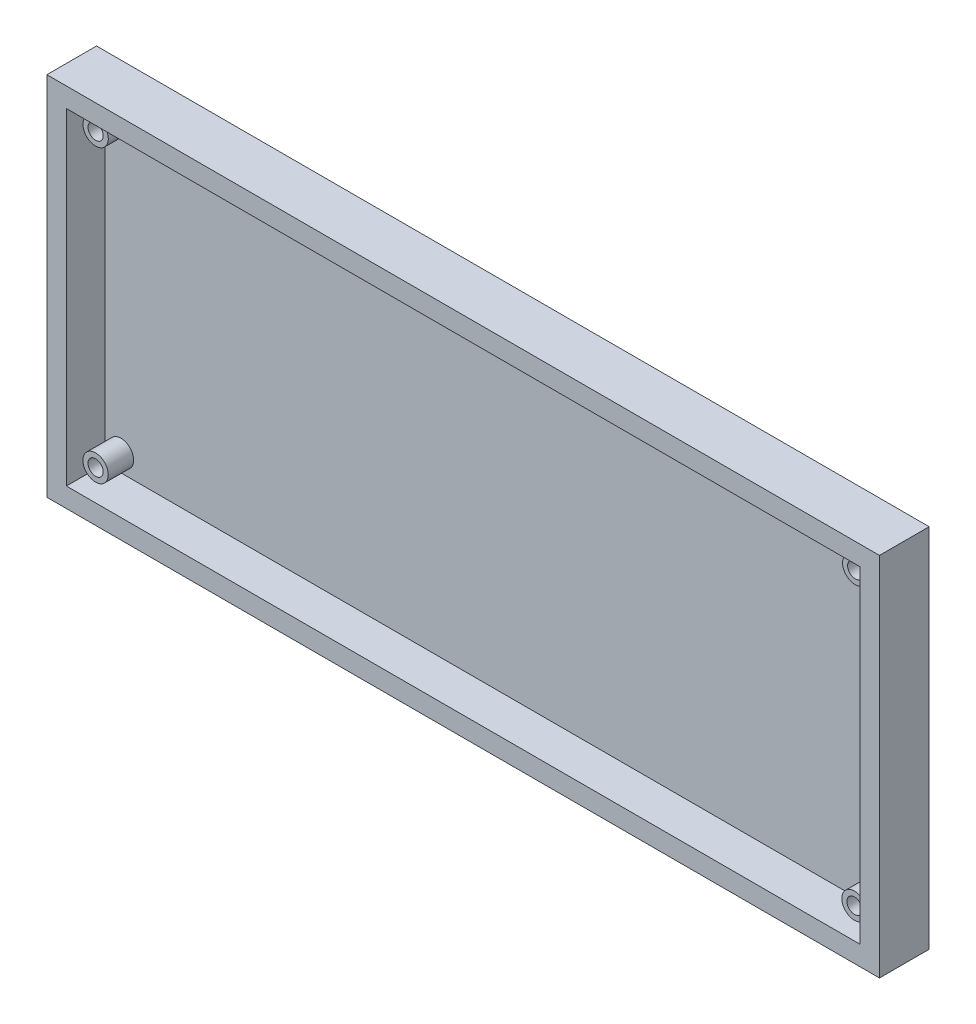
ISO-10303-21;
HEADER;
FILE_DESCRIPTION(('STEP AP214'),'2;1');
FILE_NAME('part.step','',(''),(''),'','','');
FILE_SCHEMA(('AUTOMOTIVE_DESIGN { 1 0 10303 214 1 1 1 1 }'));
ENDSEC;
DATA;
#1=APPLICATION_CONTEXT('core data for automotive mechanical design processes');
#2=APPLICATION_PROTOCOL_DEFINITION('international standard','automotive_design',2000,#1);
#3=PRODUCT_CONTEXT('',#1,'mechanical');
#4=PRODUCT('Part','Part','',(#3));
#5=PRODUCT_RELATED_PRODUCT_CATEGORY('part','',(#4));
#6=PRODUCT_DEFINITION_FORMATION('','',#4);
#7=PRODUCT_DEFINITION_CONTEXT('part definition',#1,'design');
#8=PRODUCT_DEFINITION('design','',#6,#7);
#9=PRODUCT_DEFINITION_SHAPE('','',#8);
#10=(LENGTH_UNIT() NAMED_UNIT(*) SI_UNIT(.MILLI.,.METRE.));
#11=(NAMED_UNIT(*) PLANE_ANGLE_UNIT() SI_UNIT($,.RADIAN.));
#12=(NAMED_UNIT(*) SI_UNIT($,.STERADIAN.) SOLID_ANGLE_UNIT());
#13=UNCERTAINTY_MEASURE_WITH_UNIT(LENGTH_MEASURE(1.E-05),#10,'distance_accuracy_value','');
#14=(GEOMETRIC_REPRESENTATION_CONTEXT(3) GLOBAL_UNCERTAINTY_ASSIGNED_CONTEXT((#13)) GLOBAL_UNIT_ASSIGNED_CONTEXT((#10,
#11,#12)) REPRESENTATION_CONTEXT('',''));
#15=CARTESIAN_POINT('',(0.,0.,0.));
#16=DIRECTION('',(0.,0.,1.));
#17=DIRECTION('',(1.,0.,0.));
#18=AXIS2_PLACEMENT_3D('',#15,#16,#17);
#19=CARTESIAN_POINT('',(-3.6744,71.2234,-8.89));
#20=DIRECTION('',(-1.,0.,0.));
#21=DIRECTION('',(0.,-1.,0.));
#22=AXIS2_PLACEMENT_3D('',#19,#20,#21);
#23=PLANE('',#22);
#24=DIRECTION('',(0.,1.,0.));
#25=VECTOR('',#24,1.);
#26=CARTESIAN_POINT('',(-3.67439999999999,71.2234,-6.35));
#27=LINE('',#26,#25);
#28=CARTESIAN_POINT('',(-3.67439999999999,-4.,-6.35));
#29=VERTEX_POINT('',#28);
#30=CARTESIAN_POINT('',(-3.6744,71.2234,-6.35));
#31=VERTEX_POINT('',#30);
#32=EDGE_CURVE('E59',#29,#31,#27,.T.);
#33=ORIENTED_EDGE('',*,*,#32,.T.);
#34=DIRECTION('',(0.,0.,1.));
#35=VECTOR('',#34,1.);
#36=CARTESIAN_POINT('',(-3.6744,71.2234,-8.89));
#37=LINE('',#36,#35);
#38=CARTESIAN_POINT('',(-3.6744,71.2234,2.54));
#39=VERTEX_POINT('',#38);
#40=EDGE_CURVE('E168',#31,#39,#37,.T.);
#41=ORIENTED_EDGE('',*,*,#40,.T.);
#42=DIRECTION('',(0.,-1.,0.));
#43=VECTOR('',#42,1.);
#44=CARTESIAN_POINT('',(-3.6744,71.2234,2.54));
#45=LINE('',#44,#43);
#46=CARTESIAN_POINT('',(-3.67439999999999,-4.,2.54));
#47=VERTEX_POINT('',#46);
#48=EDGE_CURVE('E139',#39,#47,#45,.T.);
#49=ORIENTED_EDGE('',*,*,#48,.T.);
#50=DIRECTION('',(0.,0.,1.));
#51=VECTOR('',#50,1.);
#52=CARTESIAN_POINT('',(-3.67439999999999,-4.,-8.89));
#53=LINE('',#52,#51);
#54=EDGE_CURVE('E121',#29,#47,#53,.T.);
#55=ORIENTED_EDGE('',*,*,#54,.F.);
#56=EDGE_LOOP('',(#33,#41,#49,#55));
#57=FACE_BOUND('',#56,.T.);
#58=ADVANCED_FACE('F43',(#57),#23,.F.);
#59=CARTESIAN_POINT('',(-3.6744,71.2234,-8.89));
#60=DIRECTION('',(0.,1.,0.));
#61=DIRECTION('',(0.,0.,1.));
#62=AXIS2_PLACEMENT_3D('',#59,#60,#61);
#63=PLANE('',#62);
#64=DIRECTION('',(1.,0.,0.));
#65=VECTOR('',#64,1.);
#66=CARTESIAN_POINT('',(178.9008,71.2234,-6.35));
#67=LINE('',#66,#65);
#68=CARTESIAN_POINT('',(178.9008,71.2234,-6.35));
#69=VERTEX_POINT('',#68);
#70=EDGE_CURVE('E66',#31,#69,#67,.T.);
#71=ORIENTED_EDGE('',*,*,#70,.T.);
#72=DIRECTION('',(0.,0.,1.));
#73=VECTOR('',#72,1.);
#74=CARTESIAN_POINT('',(178.9008,71.2234,-8.89));
#75=LINE('',#74,#73);
#76=CARTESIAN_POINT('',(178.9008,71.2234,2.54));
#77=VERTEX_POINT('',#76);
#78=EDGE_CURVE('E120',#69,#77,#75,.T.);
#79=ORIENTED_EDGE('',*,*,#78,.T.);
#80=DIRECTION('',(-1.,0.,0.));
#81=VECTOR('',#80,1.);
#82=CARTESIAN_POINT('',(-3.6744,71.2234,2.54));
#83=LINE('',#82,#81);
#84=EDGE_CURVE('E148',#77,#39,#83,.T.);
#85=ORIENTED_EDGE('',*,*,#84,.T.);
#86=ORIENTED_EDGE('',*,*,#40,.F.);
#87=EDGE_LOOP('',(#71,#79,#85,#86));
#88=FACE_BOUND('',#87,.T.);
#89=ADVANCED_FACE('F243',(#88),#63,.F.);
#90=CARTESIAN_POINT('',(178.9008,71.2234,-8.89));
#91=DIRECTION('',(1.,0.,0.));
#92=DIRECTION('',(0.,0.,-1.));
#93=AXIS2_PLACEMENT_3D('',#90,#91,#92);
#94=PLANE('',#93);
#95=DIRECTION('',(0.,-1.,0.));
#96=VECTOR('',#95,1.);
#97=CARTESIAN_POINT('',(178.9008,71.2234,-6.35));
#98=LINE('',#97,#96);
#99=CARTESIAN_POINT('',(178.9008,-4.,-6.35));
#100=VERTEX_POINT('',#99);
#101=EDGE_CURVE('E124',#69,#100,#98,.T.);
#102=ORIENTED_EDGE('',*,*,#101,.T.);
#103=DIRECTION('',(0.,0.,1.));
#104=VECTOR('',#103,1.);
#105=CARTESIAN_POINT('',(178.9008,-4.,-8.89));
#106=LINE('',#105,#104);
#107=CARTESIAN_POINT('',(178.9008,-4.,2.54));
#108=VERTEX_POINT('',#107);
#109=EDGE_CURVE('E109',#100,#108,#106,.T.);
#110=ORIENTED_EDGE('',*,*,#109,.T.);
#111=DIRECTION('',(0.,1.,0.));
#112=VECTOR('',#111,1.);
#113=CARTESIAN_POINT('',(178.9008,71.2234,2.54));
#114=LINE('',#113,#112);
#115=EDGE_CURVE('E145',#108,#77,#114,.T.);
#116=ORIENTED_EDGE('',*,*,#115,.T.);
#117=ORIENTED_EDGE('',*,*,#78,.F.);
#118=EDGE_LOOP('',(#102,#110,#116,#117));
#119=FACE_BOUND('',#118,.T.);
#120=ADVANCED_FACE('F125',(#119),#94,.F.);
#121=CARTESIAN_POINT('',(-3.67439999999999,-4.,-8.89));
#122=DIRECTION('',(0.,-1.,0.));
#123=DIRECTION('',(0.,0.,-1.));
#124=AXIS2_PLACEMENT_3D('',#121,#122,#123);
#125=PLANE('',#124);
#126=DIRECTION('',(-1.,0.,0.));
#127=VECTOR('',#126,1.);
#128=CARTESIAN_POINT('',(178.9008,-4.,-6.35));
#129=LINE('',#128,#127);
#130=EDGE_CURVE('E113',#100,#29,#129,.T.);
#131=ORIENTED_EDGE('',*,*,#130,.T.);
#132=ORIENTED_EDGE('',*,*,#54,.T.);
#133=DIRECTION('',(1.,0.,0.));
#134=VECTOR('',#133,1.);
#135=CARTESIAN_POINT('',(-3.67439999999999,-4.,2.54));
#136=LINE('',#135,#134);
#137=EDGE_CURVE('E115',#47,#108,#136,.T.);
#138=ORIENTED_EDGE('',*,*,#137,.T.);
#139=ORIENTED_EDGE('',*,*,#109,.F.);
#140=EDGE_LOOP('',(#131,#132,#138,#139));
#141=FACE_BOUND('',#140,.T.);
#142=ADVANCED_FACE('F111',(#141),#125,.F.);
#143=CARTESIAN_POINT('',(-8.1645280605346,75.7135280605346,-8.89));
#144=DIRECTION('',(-1.,0.,0.));
#145=DIRECTION('',(0.,0.,1.));
#146=AXIS2_PLACEMENT_3D('',#143,#144,#145);
#147=PLANE('',#146);
#148=DIRECTION('',(0.,0.,1.));
#149=VECTOR('',#148,1.);
#150=CARTESIAN_POINT('',(-8.1645280605346,-8.49012806053457,-8.89));
#151=LINE('',#150,#149);
#152=CARTESIAN_POINT('',(-8.1645280605346,-8.49012806053457,-8.89));
#153=VERTEX_POINT('',#152);
#154=CARTESIAN_POINT('',(-8.1645280605346,-8.49012806053457,2.54));
#155=VERTEX_POINT('',#154);
#156=EDGE_CURVE('E191',#153,#155,#151,.T.);
#157=ORIENTED_EDGE('',*,*,#156,.T.);
#158=DIRECTION('',(0.,-1.,0.));
#159=VECTOR('',#158,1.);
#160=CARTESIAN_POINT('',(-8.1645280605346,75.7135280605346,2.54));
#161=LINE('',#160,#159);
#162=CARTESIAN_POINT('',(-8.1645280605346,75.7135280605346,2.54));
#163=VERTEX_POINT('',#162);
#164=EDGE_CURVE('E152',#163,#155,#161,.T.);
#165=ORIENTED_EDGE('',*,*,#164,.F.);
#166=DIRECTION('',(0.,0.,1.));
#167=VECTOR('',#166,1.);
#168=CARTESIAN_POINT('',(-8.1645280605346,75.7135280605346,-8.89));
#169=LINE('',#168,#167);
#170=CARTESIAN_POINT('',(-8.1645280605346,75.7135280605346,-8.89));
#171=VERTEX_POINT('',#170);
#172=EDGE_CURVE('E192',#171,#163,#169,.T.);
#173=ORIENTED_EDGE('',*,*,#172,.F.);
#174=DIRECTION('',(0.,-1.,0.));
#175=VECTOR('',#174,1.);
#176=CARTESIAN_POINT('',(-8.1645280605346,75.7135280605346,-8.89));
#177=LINE('',#176,#175);
#178=EDGE_CURVE('E171',#171,#153,#177,.T.);
#179=ORIENTED_EDGE('',*,*,#178,.T.);
#180=EDGE_LOOP('',(#157,#165,#173,#179));
#181=FACE_BOUND('',#180,.T.);
#182=ADVANCED_FACE('F45',(#181),#147,.T.);
#183=CARTESIAN_POINT('',(-8.1645280605346,75.7135280605346,-8.89));
#184=DIRECTION('',(0.,1.,0.));
#185=DIRECTION('',(0.,0.,1.));
#186=AXIS2_PLACEMENT_3D('',#183,#184,#185);
#187=PLANE('',#186);
#188=ORIENTED_EDGE('',*,*,#172,.T.);
#189=DIRECTION('',(-1.,0.,0.));
#190=VECTOR('',#189,1.);
#191=CARTESIAN_POINT('',(-8.1645280605346,75.7135280605346,2.54));
#192=LINE('',#191,#190);
#193=CARTESIAN_POINT('',(183.390928060535,75.7135280605346,2.54));
#194=VERTEX_POINT('',#193);
#195=EDGE_CURVE('E164',#194,#163,#192,.T.);
#196=ORIENTED_EDGE('',*,*,#195,.F.);
#197=DIRECTION('',(0.,0.,1.));
#198=VECTOR('',#197,1.);
#199=CARTESIAN_POINT('',(183.390928060535,75.7135280605346,-8.89));
#200=LINE('',#199,#198);
#201=CARTESIAN_POINT('',(183.390928060535,75.7135280605346,-8.89));
#202=VERTEX_POINT('',#201);
#203=EDGE_CURVE('E196',#202,#194,#200,.T.);
#204=ORIENTED_EDGE('',*,*,#203,.F.);
#205=DIRECTION('',(-1.,0.,0.));
#206=VECTOR('',#205,1.);
#207=CARTESIAN_POINT('',(-8.1645280605346,75.7135280605346,-8.89));
#208=LINE('',#207,#206);
#209=EDGE_CURVE('E187',#202,#171,#208,.T.);
#210=ORIENTED_EDGE('',*,*,#209,.T.);
#211=EDGE_LOOP('',(#188,#196,#204,#210));
#212=FACE_BOUND('',#211,.T.);
#213=ADVANCED_FACE('F257',(#212),#187,.T.);
#214=CARTESIAN_POINT('',(183.390928060535,75.7135280605346,-8.89));
#215=DIRECTION('',(1.,0.,0.));
#216=DIRECTION('',(0.,0.,-1.));
#217=AXIS2_PLACEMENT_3D('',#214,#215,#216);
#218=PLANE('',#217);
#219=ORIENTED_EDGE('',*,*,#203,.T.);
#220=DIRECTION('',(0.,1.,0.));
#221=VECTOR('',#220,1.);
#222=CARTESIAN_POINT('',(183.390928060535,75.7135280605346,2.54));
#223=LINE('',#222,#221);
#224=CARTESIAN_POINT('',(183.390928060535,-8.49012806053457,2.54));
#225=VERTEX_POINT('',#224);
#226=EDGE_CURVE('E160',#225,#194,#223,.T.);
#227=ORIENTED_EDGE('',*,*,#226,.F.);
#228=DIRECTION('',(0.,0.,1.));
#229=VECTOR('',#228,1.);
#230=CARTESIAN_POINT('',(183.390928060535,-8.49012806053457,-8.89));
#231=LINE('',#230,#229);
#232=CARTESIAN_POINT('',(183.390928060535,-8.49012806053457,-8.89));
#233=VERTEX_POINT('',#232);
#234=EDGE_CURVE('E199',#233,#225,#231,.T.);
#235=ORIENTED_EDGE('',*,*,#234,.F.);
#236=DIRECTION('',(0.,1.,0.));
#237=VECTOR('',#236,1.);
#238=CARTESIAN_POINT('',(183.390928060535,75.7135280605346,-8.89));
#239=LINE('',#238,#237);
#240=EDGE_CURVE('E183',#233,#202,#239,.T.);
#241=ORIENTED_EDGE('',*,*,#240,.T.);
#242=EDGE_LOOP('',(#219,#227,#235,#241));
#243=FACE_BOUND('',#242,.T.);
#244=ADVANCED_FACE('F260',(#243),#218,.T.);
#245=CARTESIAN_POINT('',(-8.1645280605346,-8.49012806053457,-8.89));
#246=DIRECTION('',(0.,-1.,0.));
#247=DIRECTION('',(0.,0.,-1.));
#248=AXIS2_PLACEMENT_3D('',#245,#246,#247);
#249=PLANE('',#248);
#250=ORIENTED_EDGE('',*,*,#234,.T.);
#251=DIRECTION('',(1.,0.,0.));
#252=VECTOR('',#251,1.);
#253=CARTESIAN_POINT('',(-8.1645280605346,-8.49012806053457,2.54));
#254=LINE('',#253,#252);
#255=EDGE_CURVE('E156',#155,#225,#254,.T.);
#256=ORIENTED_EDGE('',*,*,#255,.F.);
#257=ORIENTED_EDGE('',*,*,#156,.F.);
#258=DIRECTION('',(1.,0.,0.));
#259=VECTOR('',#258,1.);
#260=CARTESIAN_POINT('',(-8.1645280605346,-8.49012806053457,-8.89));
#261=LINE('',#260,#259);
#262=EDGE_CURVE('E179',#153,#233,#261,.T.);
#263=ORIENTED_EDGE('',*,*,#262,.T.);
#264=EDGE_LOOP('',(#250,#256,#257,#263));
#265=FACE_BOUND('',#264,.T.);
#266=ADVANCED_FACE('F255',(#265),#249,.T.);
#267=CARTESIAN_POINT('',(0.,0.,-8.89));
#268=DIRECTION('',(0.,0.,1.));
#269=DIRECTION('',(1.,0.,0.));
#270=AXIS2_PLACEMENT_3D('',#267,#268,#269);
#271=PLANE('',#270);
#272=ORIENTED_EDGE('',*,*,#178,.F.);
#273=ORIENTED_EDGE('',*,*,#209,.F.);
#274=ORIENTED_EDGE('',*,*,#240,.F.);
#275=ORIENTED_EDGE('',*,*,#262,.F.);
#276=EDGE_LOOP('',(#272,#273,#274,#275));
#277=FACE_BOUND('',#276,.T.);
#278=ADVANCED_FACE('F252',(#277),#271,.F.);
#279=CARTESIAN_POINT('',(0.,0.,2.54));
#280=DIRECTION('',(0.,0.,1.));
#281=DIRECTION('',(1.,0.,0.));
#282=AXIS2_PLACEMENT_3D('',#279,#280,#281);
#283=PLANE('',#282);
#284=ORIENTED_EDGE('',*,*,#164,.T.);
#285=ORIENTED_EDGE('',*,*,#255,.T.);
#286=ORIENTED_EDGE('',*,*,#226,.T.);
#287=ORIENTED_EDGE('',*,*,#195,.T.);
#288=EDGE_LOOP('',(#284,#285,#286,#287));
#289=FACE_BOUND('',#288,.T.);
#290=ORIENTED_EDGE('',*,*,#137,.F.);
#291=ORIENTED_EDGE('',*,*,#48,.F.);
#292=ORIENTED_EDGE('',*,*,#84,.F.);
#293=ORIENTED_EDGE('',*,*,#115,.F.);
#294=EDGE_LOOP('',(#290,#291,#292,#293));
#295=FACE_BOUND('',#294,.T.);
#296=ADVANCED_FACE('F219',(#289,#295),#283,.T.);
#297=CARTESIAN_POINT('',(0.,0.,-6.35));
#298=DIRECTION('',(0.,0.,-1.));
#299=DIRECTION('',(-1.,0.,0.));
#300=AXIS2_PLACEMENT_3D('',#297,#298,#299);
#301=PLANE('',#300);
#302=CARTESIAN_POINT('',(0.,0.,-6.35));
#303=DIRECTION('',(0.,0.,-1.));
#304=DIRECTION('',(-1.,0.,0.));
#305=AXIS2_PLACEMENT_3D('',#302,#303,#304);
#306=CIRCLE('',#305,2.91502680016801);
#307=CARTESIAN_POINT('',(-2.91502680016801,0.,-6.35));
#308=VERTEX_POINT('',#307);
#309=EDGE_CURVE('E11',#308,#308,#306,.F.);
#310=ORIENTED_EDGE('',*,*,#309,.F.);
#311=EDGE_LOOP('',(#310));
#312=FACE_BOUND('',#311,.T.);
#313=CARTESIAN_POINT('',(174.6,0.,-6.35));
#314=DIRECTION('',(0.,0.,-1.));
#315=DIRECTION('',(-1.,0.,0.));
#316=AXIS2_PLACEMENT_3D('',#313,#314,#315);
#317=CIRCLE('',#316,2.91502680016801);
#318=CARTESIAN_POINT('',(171.684973199832,0.,-6.35));
#319=VERTEX_POINT('',#318);
#320=EDGE_CURVE('E52',#319,#319,#317,.F.);
#321=ORIENTED_EDGE('',*,*,#320,.F.);
#322=EDGE_LOOP('',(#321));
#323=FACE_BOUND('',#322,.T.);
#324=CARTESIAN_POINT('',(174.7606,66.9562,-6.35));
#325=DIRECTION('',(0.,0.,-1.));
#326=DIRECTION('',(-1.,0.,0.));
#327=AXIS2_PLACEMENT_3D('',#324,#325,#326);
#328=CIRCLE('',#327,2.91502680016801);
#329=CARTESIAN_POINT('',(171.845573199832,66.9562,-6.35));
#330=VERTEX_POINT('',#329);
#331=EDGE_CURVE('E207',#330,#330,#328,.F.);
#332=ORIENTED_EDGE('',*,*,#331,.F.);
#333=EDGE_LOOP('',(#332));
#334=FACE_BOUND('',#333,.T.);
#335=CARTESIAN_POINT('',(0.0086,66.9562,-6.35));
#336=DIRECTION('',(0.,0.,-1.));
#337=DIRECTION('',(-1.,0.,0.));
#338=AXIS2_PLACEMENT_3D('',#335,#336,#337);
#339=CIRCLE('',#338,2.915026800168);
#340=CARTESIAN_POINT('',(-2.906426800168,66.9562,-6.35));
#341=VERTEX_POINT('',#340);
#342=EDGE_CURVE('E195',#341,#341,#339,.F.);
#343=ORIENTED_EDGE('',*,*,#342,.F.);
#344=EDGE_LOOP('',(#343));
#345=FACE_BOUND('',#344,.T.);
#346=ORIENTED_EDGE('',*,*,#101,.F.);
#347=ORIENTED_EDGE('',*,*,#70,.F.);
#348=ORIENTED_EDGE('',*,*,#32,.F.);
#349=ORIENTED_EDGE('',*,*,#130,.F.);
#350=EDGE_LOOP('',(#346,#347,#348,#349));
#351=FACE_BOUND('',#350,.T.);
#352=ADVANCED_FACE('F130',(#312,#323,#334,#345,#351),#301,.F.);
#353=CARTESIAN_POINT('',(0.0086,66.9562,-0.507999999999998));
#354=DIRECTION('',(0.,0.,1.));
#355=DIRECTION('',(1.,0.,0.));
#356=AXIS2_PLACEMENT_3D('',#353,#354,#355);
#357=PLANE('',#356);
#358=CARTESIAN_POINT('',(0.0086,66.9562,-0.507999999999998));
#359=DIRECTION('',(0.,0.,1.));
#360=DIRECTION('',(1.,0.,0.));
#361=AXIS2_PLACEMENT_3D('',#358,#359,#360);
#362=CIRCLE('',#361,2.915026800168);
#363=CARTESIAN_POINT('',(2.923626800168,66.9562,-0.507999999999998));
#364=VERTEX_POINT('',#363);
#365=EDGE_CURVE('E128',#364,#364,#362,.T.);
#366=ORIENTED_EDGE('',*,*,#365,.T.);
#367=EDGE_LOOP('',(#366));
#368=FACE_BOUND('',#367,.T.);
#369=CARTESIAN_POINT('',(0.0086,66.9562,-0.507999999999998));
#370=DIRECTION('',(0.,0.,1.));
#371=DIRECTION('',(1.,0.,0.));
#372=AXIS2_PLACEMENT_3D('',#369,#370,#371);
#373=CIRCLE('',#372,1.75);
#374=CARTESIAN_POINT('',(1.7586,66.9562,-0.507999999999998));
#375=VERTEX_POINT('',#374);
#376=EDGE_CURVE('E580',#375,#375,#373,.T.);
#377=ORIENTED_EDGE('',*,*,#376,.F.);
#378=EDGE_LOOP('',(#377));
#379=FACE_BOUND('',#378,.T.);
#380=ADVANCED_FACE('F218',(#368,#379),#357,.T.);
#381=CARTESIAN_POINT('',(0.0086,66.9562,-0.507999999999998));
#382=DIRECTION('',(0.,0.,-1.));
#383=DIRECTION('',(-1.,0.,0.));
#384=AXIS2_PLACEMENT_3D('',#381,#382,#383);
#385=CYLINDRICAL_SURFACE('',#384,2.915026800168);
#386=ORIENTED_EDGE('',*,*,#365,.F.);
#387=EDGE_LOOP('',(#386));
#388=FACE_BOUND('',#387,.T.);
#389=ORIENTED_EDGE('',*,*,#342,.T.);
#390=EDGE_LOOP('',(#389));
#391=FACE_BOUND('',#390,.T.);
#392=ADVANCED_FACE('F228',(#388,#391),#385,.T.);
#393=CARTESIAN_POINT('',(0.0086,66.9562,-0.507999999999998));
#394=DIRECTION('',(0.,0.,-1.));
#395=DIRECTION('',(-1.,0.,0.));
#396=AXIS2_PLACEMENT_3D('',#393,#394,#395);
#397=CYLINDRICAL_SURFACE('',#396,1.75);
#398=ORIENTED_EDGE('',*,*,#376,.T.);
#399=EDGE_LOOP('',(#398));
#400=FACE_BOUND('',#399,.T.);
#401=CARTESIAN_POINT('',(0.0086,66.9562,-6.35));
#402=DIRECTION('',(0.,0.,1.));
#403=DIRECTION('',(1.,0.,0.));
#404=AXIS2_PLACEMENT_3D('',#401,#402,#403);
#405=CIRCLE('',#404,1.75);
#406=CARTESIAN_POINT('',(1.7586,66.9562,-6.35));
#407=VERTEX_POINT('',#406);
#408=EDGE_CURVE('E576',#407,#407,#405,.T.);
#409=ORIENTED_EDGE('',*,*,#408,.F.);
#410=EDGE_LOOP('',(#409));
#411=FACE_BOUND('',#410,.T.);
#412=ADVANCED_FACE('F230',(#400,#411),#397,.F.);
#413=ORIENTED_EDGE('',*,*,#408,.T.);
#414=EDGE_LOOP('',(#413));
#415=FACE_BOUND('',#414,.T.);
#416=ADVANCED_FACE('F223',(#415),#301,.F.);
#417=CARTESIAN_POINT('',(174.7606,66.9562,-0.507999999999998));
#418=DIRECTION('',(0.,0.,1.));
#419=DIRECTION('',(1.,0.,0.));
#420=AXIS2_PLACEMENT_3D('',#417,#418,#419);
#421=PLANE('',#420);
#422=CARTESIAN_POINT('',(174.7606,66.9562,-0.507999999999998));
#423=DIRECTION('',(0.,0.,1.));
#424=DIRECTION('',(1.,0.,0.));
#425=AXIS2_PLACEMENT_3D('',#422,#423,#424);
#426=CIRCLE('',#425,2.91502680016801);
#427=CARTESIAN_POINT('',(177.675626800168,66.9562,-0.507999999999998));
#428=VERTEX_POINT('',#427);
#429=EDGE_CURVE('E564',#428,#428,#426,.T.);
#430=ORIENTED_EDGE('',*,*,#429,.T.);
#431=EDGE_LOOP('',(#430));
#432=FACE_BOUND('',#431,.T.);
#433=CARTESIAN_POINT('',(174.7606,66.9562,-0.507999999999998));
#434=DIRECTION('',(0.,0.,1.));
#435=DIRECTION('',(1.,0.,0.));
#436=AXIS2_PLACEMENT_3D('',#433,#434,#435);
#437=CIRCLE('',#436,1.75000000000001);
#438=CARTESIAN_POINT('',(176.5106,66.9562,-0.507999999999998));
#439=VERTEX_POINT('',#438);
#440=EDGE_CURVE('E571',#439,#439,#437,.T.);
#441=ORIENTED_EDGE('',*,*,#440,.F.);
#442=EDGE_LOOP('',(#441));
#443=FACE_BOUND('',#442,.T.);
#444=ADVANCED_FACE('F326',(#432,#443),#421,.T.);
#445=CARTESIAN_POINT('',(174.7606,66.9562,-0.507999999999998));
#446=DIRECTION('',(0.,0.,-1.));
#447=DIRECTION('',(-1.,0.,0.));
#448=AXIS2_PLACEMENT_3D('',#445,#446,#447);
#449=CYLINDRICAL_SURFACE('',#448,2.91502680016801);
#450=ORIENTED_EDGE('',*,*,#429,.F.);
#451=EDGE_LOOP('',(#450));
#452=FACE_BOUND('',#451,.T.);
#453=ORIENTED_EDGE('',*,*,#331,.T.);
#454=EDGE_LOOP('',(#453));
#455=FACE_BOUND('',#454,.T.);
#456=ADVANCED_FACE('F337',(#452,#455),#449,.T.);
#457=CARTESIAN_POINT('',(174.7606,66.9562,-0.507999999999998));
#458=DIRECTION('',(0.,0.,-1.));
#459=DIRECTION('',(-1.,0.,0.));
#460=AXIS2_PLACEMENT_3D('',#457,#458,#459);
#461=CYLINDRICAL_SURFACE('',#460,1.75000000000001);
#462=ORIENTED_EDGE('',*,*,#440,.T.);
#463=EDGE_LOOP('',(#462));
#464=FACE_BOUND('',#463,.T.);
#465=CARTESIAN_POINT('',(174.7606,66.9562,-6.35));
#466=DIRECTION('',(0.,0.,1.));
#467=DIRECTION('',(1.,0.,0.));
#468=AXIS2_PLACEMENT_3D('',#465,#466,#467);
#469=CIRCLE('',#468,1.75000000000001);
#470=CARTESIAN_POINT('',(176.5106,66.9562,-6.35));
#471=VERTEX_POINT('',#470);
#472=EDGE_CURVE('E572',#471,#471,#469,.T.);
#473=ORIENTED_EDGE('',*,*,#472,.F.);
#474=EDGE_LOOP('',(#473));
#475=FACE_BOUND('',#474,.T.);
#476=ADVANCED_FACE('F348',(#464,#475),#461,.F.);
#477=ORIENTED_EDGE('',*,*,#472,.T.);
#478=EDGE_LOOP('',(#477));
#479=FACE_BOUND('',#478,.T.);
#480=ADVANCED_FACE('F328',(#479),#301,.F.);
#481=CARTESIAN_POINT('',(174.6,0.,-0.507999999999998));
#482=DIRECTION('',(0.,0.,1.));
#483=DIRECTION('',(1.,0.,0.));
#484=AXIS2_PLACEMENT_3D('',#481,#482,#483);
#485=PLANE('',#484);
#486=CARTESIAN_POINT('',(174.6,0.,-0.507999999999998));
#487=DIRECTION('',(0.,0.,1.));
#488=DIRECTION('',(1.,0.,0.));
#489=AXIS2_PLACEMENT_3D('',#486,#487,#488);
#490=CIRCLE('',#489,2.91502680016801);
#491=CARTESIAN_POINT('',(177.515026800168,0.,-0.507999999999998));
#492=VERTEX_POINT('',#491);
#493=EDGE_CURVE('E547',#492,#492,#490,.T.);
#494=ORIENTED_EDGE('',*,*,#493,.T.);
#495=EDGE_LOOP('',(#494));
#496=FACE_BOUND('',#495,.T.);
#497=CARTESIAN_POINT('',(174.6,0.,-0.507999999999998));
#498=DIRECTION('',(0.,0.,1.));
#499=DIRECTION('',(1.,0.,0.));
#500=AXIS2_PLACEMENT_3D('',#497,#498,#499);
#501=CIRCLE('',#500,1.75000000000001);
#502=CARTESIAN_POINT('',(176.35,0.,-0.507999999999998));
#503=VERTEX_POINT('',#502);
#504=EDGE_CURVE('E553',#503,#503,#501,.T.);
#505=ORIENTED_EDGE('',*,*,#504,.F.);
#506=EDGE_LOOP('',(#505));
#507=FACE_BOUND('',#506,.T.);
#508=ADVANCED_FACE('F369',(#496,#507),#485,.T.);
#509=CARTESIAN_POINT('',(174.6,0.,-0.507999999999998));
#510=DIRECTION('',(0.,0.,-1.));
#511=DIRECTION('',(-1.,0.,0.));
#512=AXIS2_PLACEMENT_3D('',#509,#510,#511);
#513=CYLINDRICAL_SURFACE('',#512,2.91502680016801);
#514=ORIENTED_EDGE('',*,*,#493,.F.);
#515=EDGE_LOOP('',(#514));
#516=FACE_BOUND('',#515,.T.);
#517=ORIENTED_EDGE('',*,*,#320,.T.);
#518=EDGE_LOOP('',(#517));
#519=FACE_BOUND('',#518,.T.);
#520=ADVANCED_FACE('F214',(#516,#519),#513,.T.);
#521=CARTESIAN_POINT('',(174.6,0.,-0.507999999999998));
#522=DIRECTION('',(0.,0.,-1.));
#523=DIRECTION('',(-1.,0.,0.));
#524=AXIS2_PLACEMENT_3D('',#521,#522,#523);
#525=CYLINDRICAL_SURFACE('',#524,1.75000000000001);
#526=ORIENTED_EDGE('',*,*,#504,.T.);
#527=EDGE_LOOP('',(#526));
#528=FACE_BOUND('',#527,.T.);
#529=CARTESIAN_POINT('',(174.6,0.,-6.35));
#530=DIRECTION('',(0.,0.,1.));
#531=DIRECTION('',(1.,0.,0.));
#532=AXIS2_PLACEMENT_3D('',#529,#530,#531);
#533=CIRCLE('',#532,1.75000000000001);
#534=CARTESIAN_POINT('',(176.35,0.,-6.35));
#535=VERTEX_POINT('',#534);
#536=EDGE_CURVE('E560',#535,#535,#533,.T.);
#537=ORIENTED_EDGE('',*,*,#536,.F.);
#538=EDGE_LOOP('',(#537));
#539=FACE_BOUND('',#538,.T.);
#540=ADVANCED_FACE('F389',(#528,#539),#525,.F.);
#541=ORIENTED_EDGE('',*,*,#536,.T.);
#542=EDGE_LOOP('',(#541));
#543=FACE_BOUND('',#542,.T.);
#544=ADVANCED_FACE('F371',(#543),#301,.F.);
#545=CARTESIAN_POINT('',(0.,0.,-0.507999999999998));
#546=DIRECTION('',(0.,0.,1.));
#547=DIRECTION('',(1.,0.,0.));
#548=AXIS2_PLACEMENT_3D('',#545,#546,#547);
#549=PLANE('',#548);
#550=CARTESIAN_POINT('',(0.,0.,-0.507999999999998));
#551=DIRECTION('',(0.,0.,1.));
#552=DIRECTION('',(1.,0.,0.));
#553=AXIS2_PLACEMENT_3D('',#550,#551,#552);
#554=CIRCLE('',#553,2.91502680016801);
#555=CARTESIAN_POINT('',(2.91502680016801,0.,-0.507999999999998));
#556=VERTEX_POINT('',#555);
#557=EDGE_CURVE('E556',#556,#556,#554,.T.);
#558=ORIENTED_EDGE('',*,*,#557,.T.);
#559=EDGE_LOOP('',(#558));
#560=FACE_BOUND('',#559,.T.);
#561=CARTESIAN_POINT('',(0.,0.,-0.507999999999998));
#562=DIRECTION('',(0.,0.,1.));
#563=DIRECTION('',(1.,0.,0.));
#564=AXIS2_PLACEMENT_3D('',#561,#562,#563);
#565=CIRCLE('',#564,1.75000000000001);
#566=CARTESIAN_POINT('',(1.75000000000001,0.,-0.507999999999998));
#567=VERTEX_POINT('',#566);
#568=EDGE_CURVE('E548',#567,#567,#565,.T.);
#569=ORIENTED_EDGE('',*,*,#568,.F.);
#570=EDGE_LOOP('',(#569));
#571=FACE_BOUND('',#570,.T.);
#572=ADVANCED_FACE('F410',(#560,#571),#549,.T.);
#573=CARTESIAN_POINT('',(0.,0.,-0.507999999999998));
#574=DIRECTION('',(0.,0.,-1.));
#575=DIRECTION('',(-1.,0.,0.));
#576=AXIS2_PLACEMENT_3D('',#573,#574,#575);
#577=CYLINDRICAL_SURFACE('',#576,2.91502680016801);
#578=ORIENTED_EDGE('',*,*,#557,.F.);
#579=EDGE_LOOP('',(#578));
#580=FACE_BOUND('',#579,.T.);
#581=ORIENTED_EDGE('',*,*,#309,.T.);
#582=EDGE_LOOP('',(#581));
#583=FACE_BOUND('',#582,.T.);
#584=ADVANCED_FACE('F419',(#580,#583),#577,.T.);
#585=CARTESIAN_POINT('',(0.,0.,-0.507999999999998));
#586=DIRECTION('',(0.,0.,-1.));
#587=DIRECTION('',(-1.,0.,0.));
#588=AXIS2_PLACEMENT_3D('',#585,#586,#587);
#589=CYLINDRICAL_SURFACE('',#588,1.75000000000001);
#590=ORIENTED_EDGE('',*,*,#568,.T.);
#591=EDGE_LOOP('',(#590));
#592=FACE_BOUND('',#591,.T.);
#593=CARTESIAN_POINT('',(0.,0.,-6.35));
#594=DIRECTION('',(0.,0.,1.));
#595=DIRECTION('',(1.,0.,0.));
#596=AXIS2_PLACEMENT_3D('',#593,#594,#595);
#597=CIRCLE('',#596,1.75000000000001);
#598=CARTESIAN_POINT('',(1.75000000000001,0.,-6.35));
#599=VERTEX_POINT('',#598);
#600=EDGE_CURVE('E544',#599,#599,#597,.T.);
#601=ORIENTED_EDGE('',*,*,#600,.F.);
#602=EDGE_LOOP('',(#601));
#603=FACE_BOUND('',#602,.T.);
#604=ADVANCED_FACE('F430',(#592,#603),#589,.F.);
#605=ORIENTED_EDGE('',*,*,#600,.T.);
#606=EDGE_LOOP('',(#605));
#607=FACE_BOUND('',#606,.T.);
#608=ADVANCED_FACE('F222',(#607),#301,.F.);
#609=CLOSED_SHELL('',(#58,#89,#120,#142,#182,#213,#244,#266,#278,#296,#352,#380,#392,#412,#416,
#444,#456,#476,#480,#508,#520,#540,#544,#572,#584,#604,#608));
#610=MANIFOLD_SOLID_BREP('B2',#609);
#611=ADVANCED_BREP_SHAPE_REPRESENTATION('',(#18,#610),#14);
#612=SHAPE_DEFINITION_REPRESENTATION(#9,#611);
ENDSEC;
END-ISO-10303-21;
